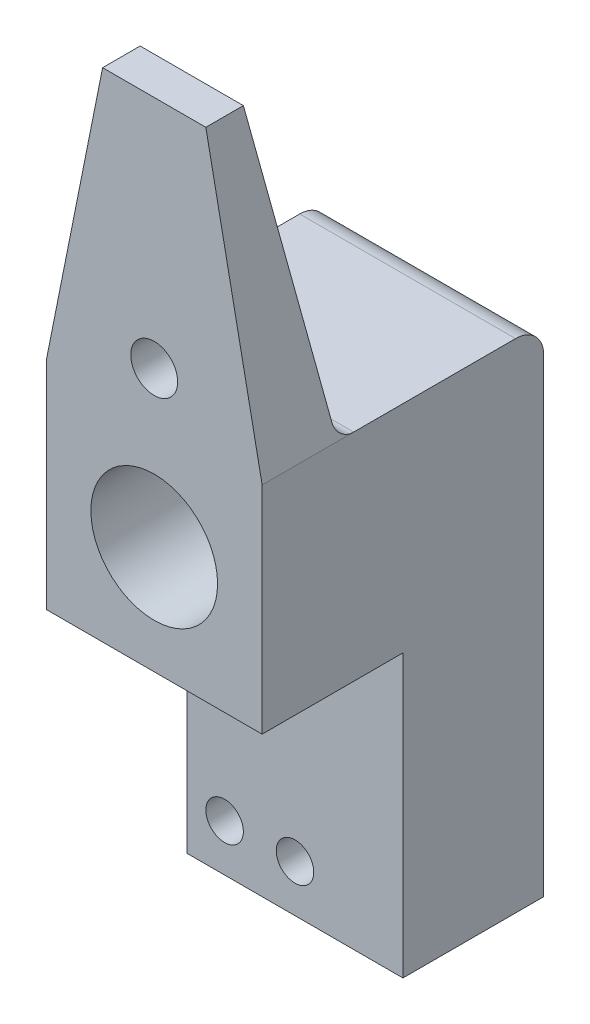
ISO-10303-21;
HEADER;
FILE_DESCRIPTION(('STEP AP214'),'2;1');
FILE_NAME('part.step','',(''),(''),'','','');
FILE_SCHEMA(('AUTOMOTIVE_DESIGN { 1 0 10303 214 1 1 1 1 }'));
ENDSEC;
DATA;
#1=APPLICATION_CONTEXT('core data for automotive mechanical design processes');
#2=APPLICATION_PROTOCOL_DEFINITION('international standard','automotive_design',2000,#1);
#3=PRODUCT_CONTEXT('',#1,'mechanical');
#4=PRODUCT('Part','Part','',(#3));
#5=PRODUCT_RELATED_PRODUCT_CATEGORY('part','',(#4));
#6=PRODUCT_DEFINITION_FORMATION('','',#4);
#7=PRODUCT_DEFINITION_CONTEXT('part definition',#1,'design');
#8=PRODUCT_DEFINITION('design','',#6,#7);
#9=PRODUCT_DEFINITION_SHAPE('','',#8);
#10=(LENGTH_UNIT() NAMED_UNIT(*) SI_UNIT(.MILLI.,.METRE.));
#11=(NAMED_UNIT(*) PLANE_ANGLE_UNIT() SI_UNIT($,.RADIAN.));
#12=(NAMED_UNIT(*) SI_UNIT($,.STERADIAN.) SOLID_ANGLE_UNIT());
#13=UNCERTAINTY_MEASURE_WITH_UNIT(LENGTH_MEASURE(1.E-05),#10,'distance_accuracy_value','');
#14=(GEOMETRIC_REPRESENTATION_CONTEXT(3) GLOBAL_UNCERTAINTY_ASSIGNED_CONTEXT((#13)) GLOBAL_UNIT_ASSIGNED_CONTEXT((#10,
#11,#12)) REPRESENTATION_CONTEXT('',''));
#15=CARTESIAN_POINT('',(0.,0.,0.));
#16=DIRECTION('',(0.,0.,1.));
#17=DIRECTION('',(1.,0.,0.));
#18=AXIS2_PLACEMENT_3D('',#15,#16,#17);
#19=CARTESIAN_POINT('',(-11.5,-11.5,20.));
#20=DIRECTION('',(0.,1.,0.));
#21=DIRECTION('',(0.,0.,1.));
#22=AXIS2_PLACEMENT_3D('',#19,#20,#21);
#23=PLANE('',#22);
#24=DIRECTION('',(-1.,0.,0.));
#25=VECTOR('',#24,1.);
#26=CARTESIAN_POINT('',(11.5,-11.5,5.));
#27=LINE('',#26,#25);
#28=CARTESIAN_POINT('',(11.5,-11.5,5.));
#29=VERTEX_POINT('',#28);
#30=CARTESIAN_POINT('',(-11.5,-11.5,5.));
#31=VERTEX_POINT('',#30);
#32=EDGE_CURVE('E151',#29,#31,#27,.T.);
#33=ORIENTED_EDGE('',*,*,#32,.F.);
#34=DIRECTION('',(0.,0.,-1.));
#35=VECTOR('',#34,1.);
#36=CARTESIAN_POINT('',(11.5,-11.5,20.));
#37=LINE('',#36,#35);
#38=CARTESIAN_POINT('',(11.5,-11.5,20.));
#39=VERTEX_POINT('',#38);
#40=EDGE_CURVE('E224',#39,#29,#37,.T.);
#41=ORIENTED_EDGE('',*,*,#40,.F.);
#42=DIRECTION('',(1.,0.,0.));
#43=VECTOR('',#42,1.);
#44=CARTESIAN_POINT('',(-11.5,-11.5,20.));
#45=LINE('',#44,#43);
#46=CARTESIAN_POINT('',(-11.5,-11.5,20.));
#47=VERTEX_POINT('',#46);
#48=EDGE_CURVE('E221',#47,#39,#45,.T.);
#49=ORIENTED_EDGE('',*,*,#48,.F.);
#50=DIRECTION('',(0.,0.,-1.));
#51=VECTOR('',#50,1.);
#52=CARTESIAN_POINT('',(-11.5,-11.5,20.));
#53=LINE('',#52,#51);
#54=EDGE_CURVE('E227',#47,#31,#53,.T.);
#55=ORIENTED_EDGE('',*,*,#54,.T.);
#56=EDGE_LOOP('',(#33,#41,#49,#55));
#57=FACE_BOUND('',#56,.T.);
#58=ADVANCED_FACE('F39',(#57),#23,.F.);
#59=CARTESIAN_POINT('',(0.,0.,20.));
#60=DIRECTION('',(0.,0.,-1.));
#61=DIRECTION('',(-1.,0.,0.));
#62=AXIS2_PLACEMENT_3D('',#59,#60,#61);
#63=CYLINDRICAL_SURFACE('',#62,6.75);
#64=CARTESIAN_POINT('',(0.,0.,20.));
#65=DIRECTION('',(0.,0.,1.));
#66=DIRECTION('',(1.,0.,0.));
#67=AXIS2_PLACEMENT_3D('',#64,#65,#66);
#68=CIRCLE('',#67,6.75);
#69=CARTESIAN_POINT('',(6.75,0.,20.));
#70=VERTEX_POINT('',#69);
#71=EDGE_CURVE('E207',#70,#70,#68,.T.);
#72=ORIENTED_EDGE('',*,*,#71,.T.);
#73=EDGE_LOOP('',(#72));
#74=FACE_BOUND('',#73,.T.);
#75=CARTESIAN_POINT('',(0.,0.,-7.));
#76=DIRECTION('',(0.,0.,-1.));
#77=DIRECTION('',(-1.,0.,0.));
#78=AXIS2_PLACEMENT_3D('',#75,#76,#77);
#79=CIRCLE('',#78,6.75);
#80=CARTESIAN_POINT('',(-6.75,0.,-7.));
#81=VERTEX_POINT('',#80);
#82=EDGE_CURVE('E133',#81,#81,#79,.T.);
#83=ORIENTED_EDGE('',*,*,#82,.T.);
#84=EDGE_LOOP('',(#83));
#85=FACE_BOUND('',#84,.T.);
#86=ADVANCED_FACE('F298',(#74,#85),#63,.F.);
#87=CARTESIAN_POINT('',(0.,0.,20.));
#88=DIRECTION('',(0.,0.,1.));
#89=DIRECTION('',(1.,0.,0.));
#90=AXIS2_PLACEMENT_3D('',#87,#88,#89);
#91=PLANE('',#90);
#92=CARTESIAN_POINT('',(0.,16.5,20.));
#93=DIRECTION('',(0.,0.,1.));
#94=DIRECTION('',(1.,0.,0.));
#95=AXIS2_PLACEMENT_3D('',#92,#93,#94);
#96=CIRCLE('',#95,2.5);
#97=CARTESIAN_POINT('',(2.5,16.5,20.));
#98=VERTEX_POINT('',#97);
#99=EDGE_CURVE('E327',#98,#98,#96,.T.);
#100=ORIENTED_EDGE('',*,*,#99,.F.);
#101=EDGE_LOOP('',(#100));
#102=FACE_BOUND('',#101,.T.);
#103=ORIENTED_EDGE('',*,*,#71,.F.);
#104=EDGE_LOOP('',(#103));
#105=FACE_BOUND('',#104,.T.);
#106=DIRECTION('',(0.,1.,0.));
#107=VECTOR('',#106,1.);
#108=CARTESIAN_POINT('',(11.5,11.5,20.));
#109=LINE('',#108,#107);
#110=CARTESIAN_POINT('',(11.5,11.5,20.));
#111=VERTEX_POINT('',#110);
#112=EDGE_CURVE('E214',#39,#111,#109,.T.);
#113=ORIENTED_EDGE('',*,*,#112,.T.);
#114=DIRECTION('',(-0.196116135138184,0.98058067569092,0.));
#115=VECTOR('',#114,1.);
#116=CARTESIAN_POINT('',(5.50000000000001,41.5,20.));
#117=LINE('',#116,#115);
#118=CARTESIAN_POINT('',(5.50000000000001,41.5,20.));
#119=VERTEX_POINT('',#118);
#120=EDGE_CURVE('E180',#111,#119,#117,.T.);
#121=ORIENTED_EDGE('',*,*,#120,.T.);
#122=DIRECTION('',(1.,0.,0.));
#123=VECTOR('',#122,1.);
#124=CARTESIAN_POINT('',(-11.5,41.5,20.));
#125=LINE('',#124,#123);
#126=CARTESIAN_POINT('',(-5.50000000000001,41.5,20.));
#127=VERTEX_POINT('',#126);
#128=EDGE_CURVE('E203',#127,#119,#125,.T.);
#129=ORIENTED_EDGE('',*,*,#128,.F.);
#130=DIRECTION('',(0.196116135138184,0.98058067569092,0.));
#131=VECTOR('',#130,1.);
#132=CARTESIAN_POINT('',(-5.50000000000001,41.5,20.));
#133=LINE('',#132,#131);
#134=CARTESIAN_POINT('',(-11.5,11.5,20.));
#135=VERTEX_POINT('',#134);
#136=EDGE_CURVE('E192',#135,#127,#133,.T.);
#137=ORIENTED_EDGE('',*,*,#136,.F.);
#138=DIRECTION('',(0.,-1.,0.));
#139=VECTOR('',#138,1.);
#140=CARTESIAN_POINT('',(-11.5,11.5,20.));
#141=LINE('',#140,#139);
#142=EDGE_CURVE('E218',#135,#47,#141,.T.);
#143=ORIENTED_EDGE('',*,*,#142,.T.);
#144=ORIENTED_EDGE('',*,*,#48,.T.);
#145=EDGE_LOOP('',(#113,#121,#129,#137,#143,#144));
#146=FACE_BOUND('',#145,.T.);
#147=ADVANCED_FACE('F278',(#102,#105,#146),#91,.T.);
#148=CARTESIAN_POINT('',(11.5,11.5,20.));
#149=DIRECTION('',(-1.,0.,0.));
#150=DIRECTION('',(0.,-1.,0.));
#151=AXIS2_PLACEMENT_3D('',#148,#149,#150);
#152=PLANE('',#151);
#153=DIRECTION('',(0.,-1.,0.));
#154=VECTOR('',#153,1.);
#155=CARTESIAN_POINT('',(11.5,11.5,-10.));
#156=LINE('',#155,#154);
#157=CARTESIAN_POINT('',(11.5,8.5,-10.));
#158=VERTEX_POINT('',#157);
#159=CARTESIAN_POINT('',(11.5,-41.5,-10.));
#160=VERTEX_POINT('',#159);
#161=EDGE_CURVE('E123',#158,#160,#156,.T.);
#162=ORIENTED_EDGE('',*,*,#161,.F.);
#163=CARTESIAN_POINT('',(11.5,8.5,-7.));
#164=DIRECTION('',(-1.,0.,0.));
#165=DIRECTION('',(0.,-1.,0.));
#166=AXIS2_PLACEMENT_3D('',#163,#164,#165);
#167=CIRCLE('',#166,3.);
#168=CARTESIAN_POINT('',(11.5,11.5,-7.));
#169=VERTEX_POINT('',#168);
#170=EDGE_CURVE('E62',#158,#169,#167,.F.);
#171=ORIENTED_EDGE('',*,*,#170,.T.);
#172=DIRECTION('',(0.,0.,-1.));
#173=VECTOR('',#172,1.);
#174=CARTESIAN_POINT('',(11.5,11.5,20.));
#175=LINE('',#174,#173);
#176=CARTESIAN_POINT('',(11.5,11.5,10.2489672066105));
#177=VERTEX_POINT('',#176);
#178=EDGE_CURVE('E233',#177,#169,#175,.T.);
#179=ORIENTED_EDGE('',*,*,#178,.F.);
#180=DIRECTION('',(0.,0.,1.));
#181=VECTOR('',#180,1.);
#182=CARTESIAN_POINT('',(11.5,11.5,0.));
#183=LINE('',#182,#181);
#184=EDGE_CURVE('E184',#177,#111,#183,.T.);
#185=ORIENTED_EDGE('',*,*,#184,.T.);
#186=ORIENTED_EDGE('',*,*,#112,.F.);
#187=ORIENTED_EDGE('',*,*,#40,.T.);
#188=DIRECTION('',(0.,1.,0.));
#189=VECTOR('',#188,1.);
#190=CARTESIAN_POINT('',(11.5,-41.5,5.));
#191=LINE('',#190,#189);
#192=CARTESIAN_POINT('',(11.5,-41.5,5.));
#193=VERTEX_POINT('',#192);
#194=EDGE_CURVE('E140',#193,#29,#191,.T.);
#195=ORIENTED_EDGE('',*,*,#194,.F.);
#196=DIRECTION('',(0.,0.,1.));
#197=VECTOR('',#196,1.);
#198=CARTESIAN_POINT('',(11.5,-41.5,-10.));
#199=LINE('',#198,#197);
#200=EDGE_CURVE('E136',#160,#193,#199,.T.);
#201=ORIENTED_EDGE('',*,*,#200,.F.);
#202=EDGE_LOOP('',(#162,#171,#179,#185,#186,#187,#195,#201));
#203=FACE_BOUND('',#202,.T.);
#204=ADVANCED_FACE('F137',(#203),#152,.F.);
#205=CARTESIAN_POINT('',(-11.5,41.5,16.));
#206=DIRECTION('',(0.,0.132163720091018,-0.991227900682635));
#207=DIRECTION('',(0.,0.991227900682635,0.132163720091018));
#208=AXIS2_PLACEMENT_3D('',#205,#206,#207);
#209=PLANE('',#208);
#210=CARTESIAN_POINT('',(0.,16.5,12.6666666666667));
#211=DIRECTION('',(0.,0.132163720091018,-0.991227900682635));
#212=DIRECTION('',(0.,0.991227900682635,0.132163720091018));
#213=AXIS2_PLACEMENT_3D('',#210,#211,#212);
#214=ELLIPSE('',#213,2.52212432507026,2.5);
#215=CARTESIAN_POINT('',(0.,19.,13.));
#216=VERTEX_POINT('',#215);
#217=EDGE_CURVE('E568',#216,#216,#214,.F.);
#218=ORIENTED_EDGE('',*,*,#217,.T.);
#219=EDGE_LOOP('',(#218));
#220=FACE_BOUND('',#219,.T.);
#221=DIRECTION('',(0.194461117065649,-0.972305585328247,-0.129640744710433));
#222=VECTOR('',#221,1.);
#223=CARTESIAN_POINT('',(4.85714285714286,44.7142857142857,16.4285714285714));
#224=LINE('',#223,#222);
#225=CARTESIAN_POINT('',(5.5,41.5,16.));
#226=VERTEX_POINT('',#225);
#227=CARTESIAN_POINT('',(11.1528654880364,13.235672559818,12.2314230079757));
#228=VERTEX_POINT('',#227);
#229=EDGE_CURVE('E188',#226,#228,#224,.T.);
#230=ORIENTED_EDGE('',*,*,#229,.T.);
#231=DIRECTION('',(1.,0.,0.));
#232=VECTOR('',#231,1.);
#233=CARTESIAN_POINT('',(-11.5,13.235672559818,12.2314230079757));
#234=LINE('',#233,#232);
#235=CARTESIAN_POINT('',(-11.1528654880364,13.235672559818,12.2314230079757));
#236=VERTEX_POINT('',#235);
#237=EDGE_CURVE('E250',#228,#236,#234,.F.);
#238=ORIENTED_EDGE('',*,*,#237,.T.);
#239=DIRECTION('',(-0.194461117065649,-0.972305585328247,-0.129640744710433));
#240=VECTOR('',#239,1.);
#241=CARTESIAN_POINT('',(-5.72689075630253,40.3655462184874,15.8487394957983));
#242=LINE('',#241,#240);
#243=CARTESIAN_POINT('',(-5.50000000000001,41.5,16.));
#244=VERTEX_POINT('',#243);
#245=EDGE_CURVE('E198',#244,#236,#242,.T.);
#246=ORIENTED_EDGE('',*,*,#245,.F.);
#247=DIRECTION('',(1.,0.,0.));
#248=VECTOR('',#247,1.);
#249=CARTESIAN_POINT('',(-11.5,41.5,16.));
#250=LINE('',#249,#248);
#251=EDGE_CURVE('E202',#244,#226,#250,.T.);
#252=ORIENTED_EDGE('',*,*,#251,.T.);
#253=EDGE_LOOP('',(#230,#238,#246,#252));
#254=FACE_BOUND('',#253,.T.);
#255=ADVANCED_FACE('F313',(#220,#254),#209,.T.);
#256=CARTESIAN_POINT('',(-11.5,41.5,16.));
#257=DIRECTION('',(0.,1.,0.));
#258=DIRECTION('',(-1.,0.,0.));
#259=AXIS2_PLACEMENT_3D('',#256,#257,#258);
#260=PLANE('',#259);
#261=ORIENTED_EDGE('',*,*,#128,.T.);
#262=DIRECTION('',(0.,0.,-1.));
#263=VECTOR('',#262,1.);
#264=CARTESIAN_POINT('',(5.5,41.5,16.));
#265=LINE('',#264,#263);
#266=EDGE_CURVE('E239',#119,#226,#265,.T.);
#267=ORIENTED_EDGE('',*,*,#266,.T.);
#268=ORIENTED_EDGE('',*,*,#251,.F.);
#269=DIRECTION('',(0.,0.,-1.));
#270=VECTOR('',#269,1.);
#271=CARTESIAN_POINT('',(-5.50000000000001,41.5,16.));
#272=LINE('',#271,#270);
#273=EDGE_CURVE('E236',#127,#244,#272,.T.);
#274=ORIENTED_EDGE('',*,*,#273,.F.);
#275=EDGE_LOOP('',(#261,#267,#268,#274));
#276=FACE_BOUND('',#275,.T.);
#277=ADVANCED_FACE('F311',(#276),#260,.T.);
#278=CARTESIAN_POINT('',(-11.5,11.5,20.));
#279=DIRECTION('',(0.,-1.,0.));
#280=DIRECTION('',(0.,0.,-1.));
#281=AXIS2_PLACEMENT_3D('',#278,#279,#280);
#282=PLANE('',#281);
#283=ORIENTED_EDGE('',*,*,#178,.T.);
#284=DIRECTION('',(1.,0.,0.));
#285=VECTOR('',#284,1.);
#286=CARTESIAN_POINT('',(-11.5,11.5,-7.));
#287=LINE('',#286,#285);
#288=CARTESIAN_POINT('',(-11.5,11.5,-7.));
#289=VERTEX_POINT('',#288);
#290=EDGE_CURVE('E48',#169,#289,#287,.F.);
#291=ORIENTED_EDGE('',*,*,#290,.T.);
#292=DIRECTION('',(0.,0.,-1.));
#293=VECTOR('',#292,1.);
#294=CARTESIAN_POINT('',(-11.5,11.5,20.));
#295=LINE('',#294,#293);
#296=CARTESIAN_POINT('',(-11.5,11.5,10.2489672066105));
#297=VERTEX_POINT('',#296);
#298=EDGE_CURVE('E230',#297,#289,#295,.T.);
#299=ORIENTED_EDGE('',*,*,#298,.F.);
#300=DIRECTION('',(1.,0.,0.));
#301=VECTOR('',#300,1.);
#302=CARTESIAN_POINT('',(-11.5,11.5,10.2489672066105));
#303=LINE('',#302,#301);
#304=EDGE_CURVE('E243',#297,#177,#303,.T.);
#305=ORIENTED_EDGE('',*,*,#304,.T.);
#306=EDGE_LOOP('',(#283,#291,#299,#305));
#307=FACE_BOUND('',#306,.T.);
#308=ADVANCED_FACE('F274',(#307),#282,.F.);
#309=CARTESIAN_POINT('',(-11.5,11.5,20.));
#310=DIRECTION('',(1.,0.,0.));
#311=DIRECTION('',(0.,1.,0.));
#312=AXIS2_PLACEMENT_3D('',#309,#310,#311);
#313=PLANE('',#312);
#314=ORIENTED_EDGE('',*,*,#298,.T.);
#315=CARTESIAN_POINT('',(-11.5,8.5,-7.));
#316=DIRECTION('',(1.,0.,0.));
#317=DIRECTION('',(0.,1.,0.));
#318=AXIS2_PLACEMENT_3D('',#315,#316,#317);
#319=CIRCLE('',#318,3.);
#320=CARTESIAN_POINT('',(-11.5,8.5,-10.));
#321=VERTEX_POINT('',#320);
#322=EDGE_CURVE('E12',#289,#321,#319,.F.);
#323=ORIENTED_EDGE('',*,*,#322,.T.);
#324=DIRECTION('',(0.,1.,0.));
#325=VECTOR('',#324,1.);
#326=CARTESIAN_POINT('',(-11.5,-11.5,-10.));
#327=LINE('',#326,#325);
#328=CARTESIAN_POINT('',(-11.5,-41.5,-10.));
#329=VERTEX_POINT('',#328);
#330=EDGE_CURVE('E132',#329,#321,#327,.T.);
#331=ORIENTED_EDGE('',*,*,#330,.F.);
#332=DIRECTION('',(0.,0.,-1.));
#333=VECTOR('',#332,1.);
#334=CARTESIAN_POINT('',(-11.5,-41.5,5.));
#335=LINE('',#334,#333);
#336=CARTESIAN_POINT('',(-11.5,-41.5,5.));
#337=VERTEX_POINT('',#336);
#338=EDGE_CURVE('E149',#337,#329,#335,.T.);
#339=ORIENTED_EDGE('',*,*,#338,.F.);
#340=DIRECTION('',(0.,1.,0.));
#341=VECTOR('',#340,1.);
#342=CARTESIAN_POINT('',(-11.5,-41.5,5.));
#343=LINE('',#342,#341);
#344=EDGE_CURVE('E163',#337,#31,#343,.T.);
#345=ORIENTED_EDGE('',*,*,#344,.T.);
#346=ORIENTED_EDGE('',*,*,#54,.F.);
#347=ORIENTED_EDGE('',*,*,#142,.F.);
#348=DIRECTION('',(0.,0.,1.));
#349=VECTOR('',#348,1.);
#350=CARTESIAN_POINT('',(-11.5,11.5,0.));
#351=LINE('',#350,#349);
#352=EDGE_CURVE('E195',#297,#135,#351,.T.);
#353=ORIENTED_EDGE('',*,*,#352,.F.);
#354=EDGE_LOOP('',(#314,#323,#331,#339,#345,#346,#347,#353));
#355=FACE_BOUND('',#354,.T.);
#356=ADVANCED_FACE('F289',(#355),#313,.F.);
#357=CARTESIAN_POINT('',(-5.50000000000001,41.5,0.));
#358=DIRECTION('',(0.98058067569092,-0.196116135138184,0.));
#359=DIRECTION('',(0.196116135138184,0.98058067569092,0.));
#360=AXIS2_PLACEMENT_3D('',#357,#358,#359);
#361=PLANE('',#360);
#362=ORIENTED_EDGE('',*,*,#245,.T.);
#363=CARTESIAN_POINT('',(-11.1,13.5,10.2489672066105));
#364=DIRECTION('',(0.98058067569092,-0.196116135138184,0.));
#365=DIRECTION('',(0.196116135138184,0.98058067569092,0.));
#366=AXIS2_PLACEMENT_3D('',#363,#364,#365);
#367=ELLIPSE('',#366,2.03960780543711,2.);
#368=EDGE_CURVE('E256',#236,#297,#367,.T.);
#369=ORIENTED_EDGE('',*,*,#368,.T.);
#370=ORIENTED_EDGE('',*,*,#352,.T.);
#371=ORIENTED_EDGE('',*,*,#136,.T.);
#372=ORIENTED_EDGE('',*,*,#273,.T.);
#373=EDGE_LOOP('',(#362,#369,#370,#371,#372));
#374=FACE_BOUND('',#373,.T.);
#375=ADVANCED_FACE('F267',(#374),#361,.F.);
#376=CARTESIAN_POINT('',(5.50000000000001,41.5,0.));
#377=DIRECTION('',(0.98058067569092,0.196116135138184,0.));
#378=DIRECTION('',(-0.196116135138184,0.98058067569092,0.));
#379=AXIS2_PLACEMENT_3D('',#376,#377,#378);
#380=PLANE('',#379);
#381=ORIENTED_EDGE('',*,*,#266,.F.);
#382=ORIENTED_EDGE('',*,*,#120,.F.);
#383=ORIENTED_EDGE('',*,*,#184,.F.);
#384=CARTESIAN_POINT('',(11.1,13.5,10.2489672066105));
#385=DIRECTION('',(0.98058067569092,0.196116135138184,0.));
#386=DIRECTION('',(0.196116135138184,-0.98058067569092,0.));
#387=AXIS2_PLACEMENT_3D('',#384,#385,#386);
#388=ELLIPSE('',#387,2.03960780543711,2.);
#389=EDGE_CURVE('E253',#177,#228,#388,.F.);
#390=ORIENTED_EDGE('',*,*,#389,.T.);
#391=ORIENTED_EDGE('',*,*,#229,.F.);
#392=EDGE_LOOP('',(#381,#382,#383,#390,#391));
#393=FACE_BOUND('',#392,.T.);
#394=ADVANCED_FACE('F344',(#393),#380,.T.);
#395=CARTESIAN_POINT('',(0.,0.,-10.));
#396=DIRECTION('',(0.,0.,-1.));
#397=DIRECTION('',(-1.,0.,0.));
#398=AXIS2_PLACEMENT_3D('',#395,#396,#397);
#399=PLANE('',#398);
#400=CARTESIAN_POINT('',(-7.5,-36.5,-10.));
#401=DIRECTION('',(0.,0.,-1.));
#402=DIRECTION('',(-1.,0.,0.));
#403=AXIS2_PLACEMENT_3D('',#400,#401,#402);
#404=CIRCLE('',#403,2.);
#405=CARTESIAN_POINT('',(-9.5,-36.5,-10.));
#406=VERTEX_POINT('',#405);
#407=EDGE_CURVE('E564',#406,#406,#404,.T.);
#408=ORIENTED_EDGE('',*,*,#407,.F.);
#409=EDGE_LOOP('',(#408));
#410=FACE_BOUND('',#409,.T.);
#411=CARTESIAN_POINT('',(0.,-36.5,-10.));
#412=DIRECTION('',(0.,0.,-1.));
#413=DIRECTION('',(-1.,0.,0.));
#414=AXIS2_PLACEMENT_3D('',#411,#412,#413);
#415=CIRCLE('',#414,2.);
#416=CARTESIAN_POINT('',(-2.,-36.5,-10.));
#417=VERTEX_POINT('',#416);
#418=EDGE_CURVE('E563',#417,#417,#415,.T.);
#419=ORIENTED_EDGE('',*,*,#418,.F.);
#420=EDGE_LOOP('',(#419));
#421=FACE_BOUND('',#420,.T.);
#422=CARTESIAN_POINT('',(0.,-16.5,-10.));
#423=DIRECTION('',(0.,0.,-1.));
#424=DIRECTION('',(-1.,0.,0.));
#425=AXIS2_PLACEMENT_3D('',#422,#423,#424);
#426=CIRCLE('',#425,2.);
#427=CARTESIAN_POINT('',(-2.,-16.5,-10.));
#428=VERTEX_POINT('',#427);
#429=EDGE_CURVE('E558',#428,#428,#426,.T.);
#430=ORIENTED_EDGE('',*,*,#429,.F.);
#431=EDGE_LOOP('',(#430));
#432=FACE_BOUND('',#431,.T.);
#433=CARTESIAN_POINT('',(-7.5,-16.5,-10.));
#434=DIRECTION('',(0.,0.,-1.));
#435=DIRECTION('',(-1.,0.,0.));
#436=AXIS2_PLACEMENT_3D('',#433,#434,#435);
#437=CIRCLE('',#436,2.);
#438=CARTESIAN_POINT('',(-9.5,-16.5,-10.));
#439=VERTEX_POINT('',#438);
#440=EDGE_CURVE('E552',#439,#439,#437,.T.);
#441=ORIENTED_EDGE('',*,*,#440,.F.);
#442=EDGE_LOOP('',(#441));
#443=FACE_BOUND('',#442,.T.);
#444=CARTESIAN_POINT('',(0.,0.,-10.));
#445=DIRECTION('',(0.,0.,-1.));
#446=DIRECTION('',(-1.,0.,0.));
#447=AXIS2_PLACEMENT_3D('',#444,#445,#446);
#448=CIRCLE('',#447,1.5);
#449=CARTESIAN_POINT('',(-1.5,0.,-10.));
#450=VERTEX_POINT('',#449);
#451=EDGE_CURVE('E170',#450,#450,#448,.T.);
#452=ORIENTED_EDGE('',*,*,#451,.F.);
#453=EDGE_LOOP('',(#452));
#454=FACE_BOUND('',#453,.T.);
#455=ORIENTED_EDGE('',*,*,#330,.T.);
#456=DIRECTION('',(1.,0.,0.));
#457=VECTOR('',#456,1.);
#458=CARTESIAN_POINT('',(11.5,8.5,-10.));
#459=LINE('',#458,#457);
#460=EDGE_CURVE('E130',#321,#158,#459,.T.);
#461=ORIENTED_EDGE('',*,*,#460,.T.);
#462=ORIENTED_EDGE('',*,*,#161,.T.);
#463=DIRECTION('',(1.,0.,0.));
#464=VECTOR('',#463,1.);
#465=CARTESIAN_POINT('',(-11.5,-41.5,-10.));
#466=LINE('',#465,#464);
#467=EDGE_CURVE('E128',#329,#160,#466,.T.);
#468=ORIENTED_EDGE('',*,*,#467,.F.);
#469=EDGE_LOOP('',(#455,#461,#462,#468));
#470=FACE_BOUND('',#469,.T.);
#471=ADVANCED_FACE('F126',(#410,#421,#432,#443,#454,#470),#399,.T.);
#472=CARTESIAN_POINT('',(0.,0.,-7.));
#473=DIRECTION('',(0.,0.,-1.));
#474=DIRECTION('',(-1.,0.,0.));
#475=AXIS2_PLACEMENT_3D('',#472,#473,#474);
#476=PLANE('',#475);
#477=CARTESIAN_POINT('',(0.,0.,-7.));
#478=DIRECTION('',(0.,0.,-1.));
#479=DIRECTION('',(-1.,0.,0.));
#480=AXIS2_PLACEMENT_3D('',#477,#478,#479);
#481=CIRCLE('',#480,1.5);
#482=CARTESIAN_POINT('',(-1.5,0.,-7.));
#483=VERTEX_POINT('',#482);
#484=EDGE_CURVE('E174',#483,#483,#481,.T.);
#485=ORIENTED_EDGE('',*,*,#484,.T.);
#486=EDGE_LOOP('',(#485));
#487=FACE_BOUND('',#486,.T.);
#488=ORIENTED_EDGE('',*,*,#82,.F.);
#489=EDGE_LOOP('',(#488));
#490=FACE_BOUND('',#489,.T.);
#491=ADVANCED_FACE('F332',(#487,#490),#476,.F.);
#492=CARTESIAN_POINT('',(0.,0.,24.2426406871193));
#493=DIRECTION('',(0.,0.,-1.));
#494=DIRECTION('',(-1.,0.,0.));
#495=AXIS2_PLACEMENT_3D('',#492,#493,#494);
#496=CYLINDRICAL_SURFACE('',#495,1.5);
#497=ORIENTED_EDGE('',*,*,#451,.T.);
#498=EDGE_LOOP('',(#497));
#499=FACE_BOUND('',#498,.T.);
#500=ORIENTED_EDGE('',*,*,#484,.F.);
#501=EDGE_LOOP('',(#500));
#502=FACE_BOUND('',#501,.T.);
#503=ADVANCED_FACE('F334',(#499,#502),#496,.F.);
#504=CARTESIAN_POINT('',(11.5,-41.5,5.));
#505=DIRECTION('',(0.,0.,-1.));
#506=DIRECTION('',(-1.,0.,0.));
#507=AXIS2_PLACEMENT_3D('',#504,#505,#506);
#508=PLANE('',#507);
#509=CARTESIAN_POINT('',(-7.5,-36.5,5.));
#510=DIRECTION('',(0.,0.,-1.));
#511=DIRECTION('',(-1.,0.,0.));
#512=AXIS2_PLACEMENT_3D('',#509,#510,#511);
#513=CIRCLE('',#512,2.);
#514=CARTESIAN_POINT('',(-9.5,-36.5,5.));
#515=VERTEX_POINT('',#514);
#516=EDGE_CURVE('E540',#515,#515,#513,.F.);
#517=ORIENTED_EDGE('',*,*,#516,.F.);
#518=EDGE_LOOP('',(#517));
#519=FACE_BOUND('',#518,.T.);
#520=CARTESIAN_POINT('',(0.,-36.5,5.));
#521=DIRECTION('',(0.,0.,-1.));
#522=DIRECTION('',(-1.,0.,0.));
#523=AXIS2_PLACEMENT_3D('',#520,#521,#522);
#524=CIRCLE('',#523,2.);
#525=CARTESIAN_POINT('',(-2.,-36.5,5.));
#526=VERTEX_POINT('',#525);
#527=EDGE_CURVE('E544',#526,#526,#524,.F.);
#528=ORIENTED_EDGE('',*,*,#527,.F.);
#529=EDGE_LOOP('',(#528));
#530=FACE_BOUND('',#529,.T.);
#531=CARTESIAN_POINT('',(0.,-16.5,5.));
#532=DIRECTION('',(0.,0.,-1.));
#533=DIRECTION('',(-1.,0.,0.));
#534=AXIS2_PLACEMENT_3D('',#531,#532,#533);
#535=CIRCLE('',#534,2.);
#536=CARTESIAN_POINT('',(-2.,-16.5,5.));
#537=VERTEX_POINT('',#536);
#538=EDGE_CURVE('E548',#537,#537,#535,.F.);
#539=ORIENTED_EDGE('',*,*,#538,.F.);
#540=EDGE_LOOP('',(#539));
#541=FACE_BOUND('',#540,.T.);
#542=CARTESIAN_POINT('',(-7.5,-16.5,5.));
#543=DIRECTION('',(0.,0.,-1.));
#544=DIRECTION('',(-1.,0.,0.));
#545=AXIS2_PLACEMENT_3D('',#542,#543,#544);
#546=CIRCLE('',#545,2.);
#547=CARTESIAN_POINT('',(-9.5,-16.5,5.));
#548=VERTEX_POINT('',#547);
#549=EDGE_CURVE('E155',#548,#548,#546,.F.);
#550=ORIENTED_EDGE('',*,*,#549,.F.);
#551=EDGE_LOOP('',(#550));
#552=FACE_BOUND('',#551,.T.);
#553=ORIENTED_EDGE('',*,*,#32,.T.);
#554=ORIENTED_EDGE('',*,*,#344,.F.);
#555=DIRECTION('',(-1.,0.,0.));
#556=VECTOR('',#555,1.);
#557=CARTESIAN_POINT('',(11.5,-41.5,5.));
#558=LINE('',#557,#556);
#559=EDGE_CURVE('E144',#193,#337,#558,.T.);
#560=ORIENTED_EDGE('',*,*,#559,.F.);
#561=ORIENTED_EDGE('',*,*,#194,.T.);
#562=EDGE_LOOP('',(#553,#554,#560,#561));
#563=FACE_BOUND('',#562,.T.);
#564=ADVANCED_FACE('F286',(#519,#530,#541,#552,#563),#508,.F.);
#565=CARTESIAN_POINT('',(0.,-41.5,0.));
#566=DIRECTION('',(0.,-1.,0.));
#567=DIRECTION('',(0.,0.,-1.));
#568=AXIS2_PLACEMENT_3D('',#565,#566,#567);
#569=PLANE('',#568);
#570=ORIENTED_EDGE('',*,*,#467,.T.);
#571=ORIENTED_EDGE('',*,*,#200,.T.);
#572=ORIENTED_EDGE('',*,*,#559,.T.);
#573=ORIENTED_EDGE('',*,*,#338,.T.);
#574=EDGE_LOOP('',(#570,#571,#572,#573));
#575=FACE_BOUND('',#574,.T.);
#576=ADVANCED_FACE('F147',(#575),#569,.T.);
#577=CARTESIAN_POINT('',(-7.5,-16.5,10.6568542494924));
#578=DIRECTION('',(0.,0.,-1.));
#579=DIRECTION('',(-1.,0.,0.));
#580=AXIS2_PLACEMENT_3D('',#577,#578,#579);
#581=CYLINDRICAL_SURFACE('',#580,2.);
#582=ORIENTED_EDGE('',*,*,#549,.T.);
#583=EDGE_LOOP('',(#582));
#584=FACE_BOUND('',#583,.T.);
#585=ORIENTED_EDGE('',*,*,#440,.T.);
#586=EDGE_LOOP('',(#585));
#587=FACE_BOUND('',#586,.T.);
#588=ADVANCED_FACE('F437',(#584,#587),#581,.F.);
#589=CARTESIAN_POINT('',(0.,-16.5,10.6568542494924));
#590=DIRECTION('',(0.,0.,-1.));
#591=DIRECTION('',(-1.,0.,0.));
#592=AXIS2_PLACEMENT_3D('',#589,#590,#591);
#593=CYLINDRICAL_SURFACE('',#592,2.);
#594=ORIENTED_EDGE('',*,*,#538,.T.);
#595=EDGE_LOOP('',(#594));
#596=FACE_BOUND('',#595,.T.);
#597=ORIENTED_EDGE('',*,*,#429,.T.);
#598=EDGE_LOOP('',(#597));
#599=FACE_BOUND('',#598,.T.);
#600=ADVANCED_FACE('F428',(#596,#599),#593,.F.);
#601=CARTESIAN_POINT('',(0.,-36.5,10.6568542494924));
#602=DIRECTION('',(0.,0.,-1.));
#603=DIRECTION('',(-1.,0.,0.));
#604=AXIS2_PLACEMENT_3D('',#601,#602,#603);
#605=CYLINDRICAL_SURFACE('',#604,2.);
#606=ORIENTED_EDGE('',*,*,#527,.T.);
#607=EDGE_LOOP('',(#606));
#608=FACE_BOUND('',#607,.T.);
#609=ORIENTED_EDGE('',*,*,#418,.T.);
#610=EDGE_LOOP('',(#609));
#611=FACE_BOUND('',#610,.T.);
#612=ADVANCED_FACE('F419',(#608,#611),#605,.F.);
#613=CARTESIAN_POINT('',(-7.5,-36.5,10.6568542494924));
#614=DIRECTION('',(0.,0.,-1.));
#615=DIRECTION('',(-1.,0.,0.));
#616=AXIS2_PLACEMENT_3D('',#613,#614,#615);
#617=CYLINDRICAL_SURFACE('',#616,2.);
#618=ORIENTED_EDGE('',*,*,#516,.T.);
#619=EDGE_LOOP('',(#618));
#620=FACE_BOUND('',#619,.T.);
#621=ORIENTED_EDGE('',*,*,#407,.T.);
#622=EDGE_LOOP('',(#621));
#623=FACE_BOUND('',#622,.T.);
#624=ADVANCED_FACE('F410',(#620,#623),#617,.F.);
#625=CARTESIAN_POINT('',(0.,16.5,5.56431033422848));
#626=DIRECTION('',(0.,0.,1.));
#627=DIRECTION('',(1.,0.,0.));
#628=AXIS2_PLACEMENT_3D('',#625,#626,#627);
#629=CYLINDRICAL_SURFACE('',#628,2.5);
#630=ORIENTED_EDGE('',*,*,#99,.T.);
#631=EDGE_LOOP('',(#630));
#632=FACE_BOUND('',#631,.T.);
#633=ORIENTED_EDGE('',*,*,#217,.F.);
#634=EDGE_LOOP('',(#633));
#635=FACE_BOUND('',#634,.T.);
#636=ADVANCED_FACE('F296',(#632,#635),#629,.F.);
#637=CARTESIAN_POINT('',(-11.5,13.5,10.2489672066105));
#638=DIRECTION('',(1.,0.,0.));
#639=DIRECTION('',(0.,0.,-1.));
#640=AXIS2_PLACEMENT_3D('',#637,#638,#639);
#641=CYLINDRICAL_SURFACE('',#640,2.);
#642=ORIENTED_EDGE('',*,*,#368,.F.);
#643=ORIENTED_EDGE('',*,*,#237,.F.);
#644=ORIENTED_EDGE('',*,*,#389,.F.);
#645=ORIENTED_EDGE('',*,*,#304,.F.);
#646=EDGE_LOOP('',(#642,#643,#644,#645));
#647=FACE_BOUND('',#646,.T.);
#648=ADVANCED_FACE('F273',(#647),#641,.F.);
#649=CARTESIAN_POINT('',(0.,8.5,-7.));
#650=DIRECTION('',(-1.,0.,0.));
#651=DIRECTION('',(0.,0.,1.));
#652=AXIS2_PLACEMENT_3D('',#649,#650,#651);
#653=CYLINDRICAL_SURFACE('',#652,3.);
#654=ORIENTED_EDGE('',*,*,#322,.F.);
#655=ORIENTED_EDGE('',*,*,#290,.F.);
#656=ORIENTED_EDGE('',*,*,#170,.F.);
#657=ORIENTED_EDGE('',*,*,#460,.F.);
#658=EDGE_LOOP('',(#654,#655,#656,#657));
#659=FACE_BOUND('',#658,.T.);
#660=ADVANCED_FACE('F41',(#659),#653,.T.);
#661=CLOSED_SHELL('',(#58,#86,#147,#204,#255,#277,#308,#356,#375,#394,#471,#491,#503,#564,#576,
#588,#600,#612,#624,#636,#648,#660));
#662=MANIFOLD_SOLID_BREP('B2',#661);
#663=ADVANCED_BREP_SHAPE_REPRESENTATION('',(#18,#662),#14);
#664=SHAPE_DEFINITION_REPRESENTATION(#9,#663);
ENDSEC;
END-ISO-10303-21;
